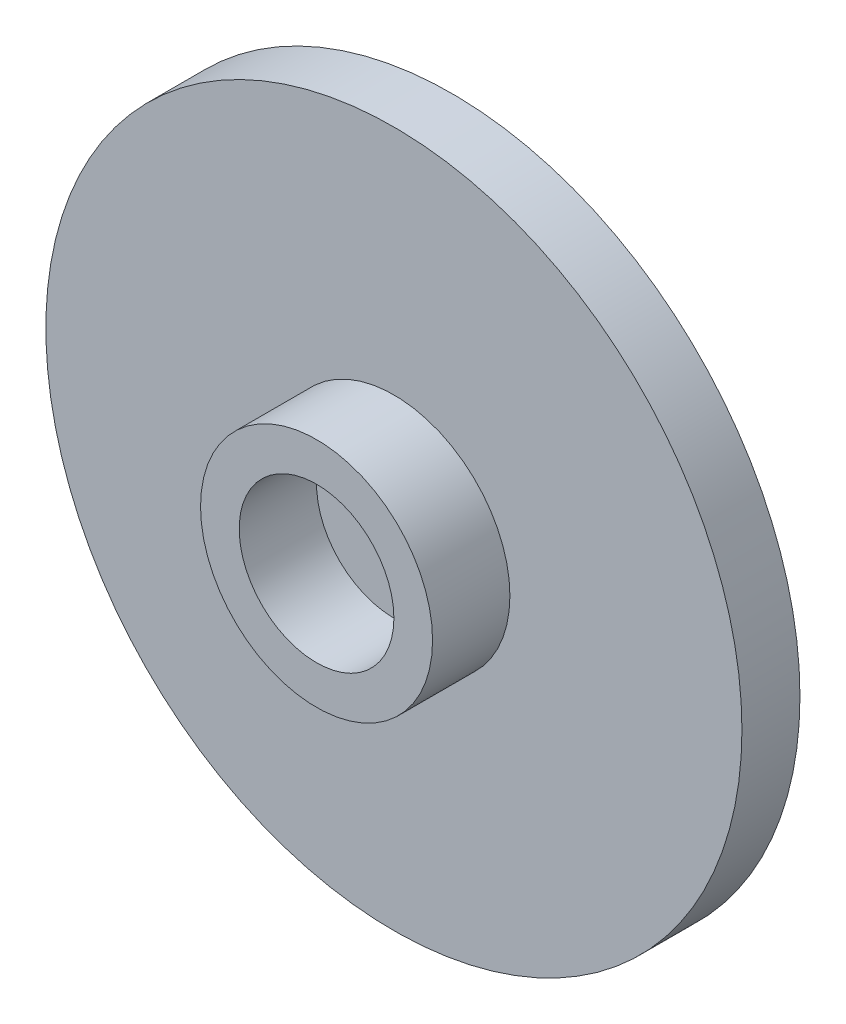
ISO-10303-21;
HEADER;
FILE_DESCRIPTION(('STEP AP214'),'2;1');
FILE_NAME('part.step','',(''),(''),'','','');
FILE_SCHEMA(('AUTOMOTIVE_DESIGN { 1 0 10303 214 1 1 1 1 }'));
ENDSEC;
DATA;
#1=APPLICATION_CONTEXT('core data for automotive mechanical design processes');
#2=APPLICATION_PROTOCOL_DEFINITION('international standard','automotive_design',2000,#1);
#3=PRODUCT_CONTEXT('',#1,'mechanical');
#4=PRODUCT('Part','Part','',(#3));
#5=PRODUCT_RELATED_PRODUCT_CATEGORY('part','',(#4));
#6=PRODUCT_DEFINITION_FORMATION('','',#4);
#7=PRODUCT_DEFINITION_CONTEXT('part definition',#1,'design');
#8=PRODUCT_DEFINITION('design','',#6,#7);
#9=PRODUCT_DEFINITION_SHAPE('','',#8);
#10=(LENGTH_UNIT() NAMED_UNIT(*) SI_UNIT(.MILLI.,.METRE.));
#11=(NAMED_UNIT(*) PLANE_ANGLE_UNIT() SI_UNIT($,.RADIAN.));
#12=(NAMED_UNIT(*) SI_UNIT($,.STERADIAN.) SOLID_ANGLE_UNIT());
#13=UNCERTAINTY_MEASURE_WITH_UNIT(LENGTH_MEASURE(1.E-05),#10,'distance_accuracy_value','');
#14=(GEOMETRIC_REPRESENTATION_CONTEXT(3) GLOBAL_UNCERTAINTY_ASSIGNED_CONTEXT((#13)) GLOBAL_UNIT_ASSIGNED_CONTEXT((#10,
#11,#12)) REPRESENTATION_CONTEXT('',''));
#15=CARTESIAN_POINT('',(0.,0.,0.));
#16=DIRECTION('',(0.,0.,1.));
#17=DIRECTION('',(1.,0.,0.));
#18=AXIS2_PLACEMENT_3D('',#15,#16,#17);
#19=CARTESIAN_POINT('',(0.,0.,0.));
#20=DIRECTION('',(0.,0.,1.));
#21=DIRECTION('',(1.,0.,0.));
#22=AXIS2_PLACEMENT_3D('',#19,#20,#21);
#23=PLANE('',#22);
#24=CARTESIAN_POINT('',(0.,0.,0.));
#25=DIRECTION('',(0.,0.,1.));
#26=DIRECTION('',(1.,0.,0.));
#27=AXIS2_PLACEMENT_3D('',#24,#25,#26);
#28=CIRCLE('',#27,0.75);
#29=CARTESIAN_POINT('',(0.75,0.,0.));
#30=VERTEX_POINT('',#29);
#31=EDGE_CURVE('E62',#30,#30,#28,.T.);
#32=ORIENTED_EDGE('',*,*,#31,.T.);
#33=EDGE_LOOP('',(#32));
#34=FACE_BOUND('',#33,.T.);
#35=CARTESIAN_POINT('',(0.,0.,0.));
#36=DIRECTION('',(0.,0.,-1.));
#37=DIRECTION('',(-1.,0.,0.));
#38=AXIS2_PLACEMENT_3D('',#35,#36,#37);
#39=CIRCLE('',#38,2.);
#40=CARTESIAN_POINT('',(-2.,0.,0.));
#41=VERTEX_POINT('',#40);
#42=EDGE_CURVE('E86',#41,#41,#39,.T.);
#43=ORIENTED_EDGE('',*,*,#42,.T.);
#44=EDGE_LOOP('',(#43));
#45=FACE_BOUND('',#44,.T.);
#46=ADVANCED_FACE('F37',(#34,#45),#23,.F.);
#47=CARTESIAN_POINT('',(0.,0.,1.5));
#48=DIRECTION('',(0.,0.,1.));
#49=DIRECTION('',(1.,0.,0.));
#50=AXIS2_PLACEMENT_3D('',#47,#48,#49);
#51=PLANE('',#50);
#52=CARTESIAN_POINT('',(0.,0.,1.5));
#53=DIRECTION('',(0.,0.,1.));
#54=DIRECTION('',(1.,0.,0.));
#55=AXIS2_PLACEMENT_3D('',#52,#53,#54);
#56=CIRCLE('',#55,0.75);
#57=CARTESIAN_POINT('',(0.75,0.,1.5));
#58=VERTEX_POINT('',#57);
#59=EDGE_CURVE('E60',#58,#58,#56,.T.);
#60=ORIENTED_EDGE('',*,*,#59,.F.);
#61=EDGE_LOOP('',(#60));
#62=FACE_BOUND('',#61,.T.);
#63=CARTESIAN_POINT('',(0.,0.,1.5));
#64=DIRECTION('',(0.,0.,1.));
#65=DIRECTION('',(1.,0.,0.));
#66=AXIS2_PLACEMENT_3D('',#63,#64,#65);
#67=CIRCLE('',#66,2.);
#68=CARTESIAN_POINT('',(2.,0.,1.5));
#69=VERTEX_POINT('',#68);
#70=EDGE_CURVE('E45',#69,#69,#67,.F.);
#71=ORIENTED_EDGE('',*,*,#70,.F.);
#72=EDGE_LOOP('',(#71));
#73=FACE_BOUND('',#72,.T.);
#74=ADVANCED_FACE('F114',(#62,#73),#51,.T.);
#75=CARTESIAN_POINT('',(0.,0.,1.5));
#76=DIRECTION('',(0.,0.,1.));
#77=DIRECTION('',(1.,0.,0.));
#78=AXIS2_PLACEMENT_3D('',#75,#76,#77);
#79=CIRCLE('',#78,3.);
#80=CARTESIAN_POINT('',(3.,0.,1.5));
#81=VERTEX_POINT('',#80);
#82=EDGE_CURVE('E70',#81,#81,#79,.T.);
#83=ORIENTED_EDGE('',*,*,#82,.F.);
#84=EDGE_LOOP('',(#83));
#85=FACE_BOUND('',#84,.T.);
#86=CARTESIAN_POINT('',(0.,0.,1.5));
#87=DIRECTION('',(0.,0.,1.));
#88=DIRECTION('',(1.,0.,0.));
#89=AXIS2_PLACEMENT_3D('',#86,#87,#88);
#90=CIRCLE('',#89,9.);
#91=CARTESIAN_POINT('',(9.,0.,1.5));
#92=VERTEX_POINT('',#91);
#93=EDGE_CURVE('E50',#92,#92,#90,.T.);
#94=ORIENTED_EDGE('',*,*,#93,.T.);
#95=EDGE_LOOP('',(#94));
#96=FACE_BOUND('',#95,.T.);
#97=ADVANCED_FACE('F120',(#85,#96),#51,.T.);
#98=CARTESIAN_POINT('',(0.,0.,0.));
#99=DIRECTION('',(0.,0.,1.));
#100=DIRECTION('',(1.,0.,0.));
#101=AXIS2_PLACEMENT_3D('',#98,#99,#100);
#102=CIRCLE('',#101,3.);
#103=CARTESIAN_POINT('',(3.,0.,0.));
#104=VERTEX_POINT('',#103);
#105=EDGE_CURVE('E10',#104,#104,#102,.F.);
#106=ORIENTED_EDGE('',*,*,#105,.F.);
#107=EDGE_LOOP('',(#106));
#108=FACE_BOUND('',#107,.T.);
#109=CARTESIAN_POINT('',(0.,0.,0.));
#110=DIRECTION('',(0.,0.,1.));
#111=DIRECTION('',(1.,0.,0.));
#112=AXIS2_PLACEMENT_3D('',#109,#110,#111);
#113=CIRCLE('',#112,9.);
#114=CARTESIAN_POINT('',(9.,0.,0.));
#115=VERTEX_POINT('',#114);
#116=EDGE_CURVE('E55',#115,#115,#113,.T.);
#117=ORIENTED_EDGE('',*,*,#116,.F.);
#118=EDGE_LOOP('',(#117));
#119=FACE_BOUND('',#118,.T.);
#120=ADVANCED_FACE('F116',(#108,#119),#23,.F.);
#121=CARTESIAN_POINT('',(0.,0.,1.5));
#122=DIRECTION('',(0.,0.,-1.));
#123=DIRECTION('',(-1.,0.,0.));
#124=AXIS2_PLACEMENT_3D('',#121,#122,#123);
#125=CYLINDRICAL_SURFACE('',#124,9.);
#126=ORIENTED_EDGE('',*,*,#93,.F.);
#127=EDGE_LOOP('',(#126));
#128=FACE_BOUND('',#127,.T.);
#129=ORIENTED_EDGE('',*,*,#116,.T.);
#130=EDGE_LOOP('',(#129));
#131=FACE_BOUND('',#130,.T.);
#132=ADVANCED_FACE('F39',(#128,#131),#125,.T.);
#133=CARTESIAN_POINT('',(0.,0.,1.5));
#134=DIRECTION('',(0.,0.,-1.));
#135=DIRECTION('',(-1.,0.,0.));
#136=AXIS2_PLACEMENT_3D('',#133,#134,#135);
#137=CYLINDRICAL_SURFACE('',#136,0.75);
#138=ORIENTED_EDGE('',*,*,#59,.T.);
#139=EDGE_LOOP('',(#138));
#140=FACE_BOUND('',#139,.T.);
#141=ORIENTED_EDGE('',*,*,#31,.F.);
#142=EDGE_LOOP('',(#141));
#143=FACE_BOUND('',#142,.T.);
#144=ADVANCED_FACE('F130',(#140,#143),#137,.F.);
#145=CARTESIAN_POINT('',(0.,0.,3.5));
#146=DIRECTION('',(0.,0.,1.));
#147=DIRECTION('',(1.,0.,0.));
#148=AXIS2_PLACEMENT_3D('',#145,#146,#147);
#149=PLANE('',#148);
#150=CARTESIAN_POINT('',(0.,0.,3.5));
#151=DIRECTION('',(0.,0.,1.));
#152=DIRECTION('',(1.,0.,0.));
#153=AXIS2_PLACEMENT_3D('',#150,#151,#152);
#154=CIRCLE('',#153,3.);
#155=CARTESIAN_POINT('',(3.,0.,3.5));
#156=VERTEX_POINT('',#155);
#157=EDGE_CURVE('E66',#156,#156,#154,.T.);
#158=ORIENTED_EDGE('',*,*,#157,.T.);
#159=EDGE_LOOP('',(#158));
#160=FACE_BOUND('',#159,.T.);
#161=CARTESIAN_POINT('',(0.,0.,3.5));
#162=DIRECTION('',(0.,0.,1.));
#163=DIRECTION('',(1.,0.,0.));
#164=AXIS2_PLACEMENT_3D('',#161,#162,#163);
#165=CIRCLE('',#164,2.);
#166=CARTESIAN_POINT('',(2.,0.,3.5));
#167=VERTEX_POINT('',#166);
#168=EDGE_CURVE('E74',#167,#167,#165,.T.);
#169=ORIENTED_EDGE('',*,*,#168,.F.);
#170=EDGE_LOOP('',(#169));
#171=FACE_BOUND('',#170,.T.);
#172=ADVANCED_FACE('F143',(#160,#171),#149,.T.);
#173=CARTESIAN_POINT('',(0.,0.,3.5));
#174=DIRECTION('',(0.,0.,-1.));
#175=DIRECTION('',(-1.,0.,0.));
#176=AXIS2_PLACEMENT_3D('',#173,#174,#175);
#177=CYLINDRICAL_SURFACE('',#176,3.);
#178=ORIENTED_EDGE('',*,*,#157,.F.);
#179=EDGE_LOOP('',(#178));
#180=FACE_BOUND('',#179,.T.);
#181=ORIENTED_EDGE('',*,*,#82,.T.);
#182=EDGE_LOOP('',(#181));
#183=FACE_BOUND('',#182,.T.);
#184=ADVANCED_FACE('F109',(#180,#183),#177,.T.);
#185=CARTESIAN_POINT('',(0.,0.,3.5));
#186=DIRECTION('',(0.,0.,-1.));
#187=DIRECTION('',(-1.,0.,0.));
#188=AXIS2_PLACEMENT_3D('',#185,#186,#187);
#189=CYLINDRICAL_SURFACE('',#188,2.);
#190=ORIENTED_EDGE('',*,*,#168,.T.);
#191=EDGE_LOOP('',(#190));
#192=FACE_BOUND('',#191,.T.);
#193=ORIENTED_EDGE('',*,*,#70,.T.);
#194=EDGE_LOOP('',(#193));
#195=FACE_BOUND('',#194,.T.);
#196=ADVANCED_FACE('F100',(#192,#195),#189,.F.);
#197=CARTESIAN_POINT('',(0.,0.,-1.));
#198=DIRECTION('',(0.,0.,-1.));
#199=DIRECTION('',(-1.,0.,0.));
#200=AXIS2_PLACEMENT_3D('',#197,#198,#199);
#201=PLANE('',#200);
#202=CARTESIAN_POINT('',(0.,0.,-1.));
#203=DIRECTION('',(0.,0.,-1.));
#204=DIRECTION('',(-1.,0.,0.));
#205=AXIS2_PLACEMENT_3D('',#202,#203,#204);
#206=CIRCLE('',#205,3.);
#207=CARTESIAN_POINT('',(-3.,0.,-1.));
#208=VERTEX_POINT('',#207);
#209=EDGE_CURVE('E81',#208,#208,#206,.T.);
#210=ORIENTED_EDGE('',*,*,#209,.T.);
#211=EDGE_LOOP('',(#210));
#212=FACE_BOUND('',#211,.T.);
#213=CARTESIAN_POINT('',(0.,0.,-1.));
#214=DIRECTION('',(0.,0.,-1.));
#215=DIRECTION('',(-1.,0.,0.));
#216=AXIS2_PLACEMENT_3D('',#213,#214,#215);
#217=CIRCLE('',#216,2.);
#218=CARTESIAN_POINT('',(-2.,0.,-1.));
#219=VERTEX_POINT('',#218);
#220=EDGE_CURVE('E85',#219,#219,#217,.T.);
#221=ORIENTED_EDGE('',*,*,#220,.F.);
#222=EDGE_LOOP('',(#221));
#223=FACE_BOUND('',#222,.T.);
#224=ADVANCED_FACE('F97',(#212,#223),#201,.T.);
#225=CARTESIAN_POINT('',(0.,0.,-1.));
#226=DIRECTION('',(0.,0.,1.));
#227=DIRECTION('',(1.,0.,0.));
#228=AXIS2_PLACEMENT_3D('',#225,#226,#227);
#229=CYLINDRICAL_SURFACE('',#228,3.);
#230=ORIENTED_EDGE('',*,*,#209,.F.);
#231=EDGE_LOOP('',(#230));
#232=FACE_BOUND('',#231,.T.);
#233=ORIENTED_EDGE('',*,*,#105,.T.);
#234=EDGE_LOOP('',(#233));
#235=FACE_BOUND('',#234,.T.);
#236=ADVANCED_FACE('F99',(#232,#235),#229,.T.);
#237=CARTESIAN_POINT('',(0.,0.,-1.));
#238=DIRECTION('',(0.,0.,1.));
#239=DIRECTION('',(1.,0.,0.));
#240=AXIS2_PLACEMENT_3D('',#237,#238,#239);
#241=CYLINDRICAL_SURFACE('',#240,2.);
#242=ORIENTED_EDGE('',*,*,#220,.T.);
#243=EDGE_LOOP('',(#242));
#244=FACE_BOUND('',#243,.T.);
#245=ORIENTED_EDGE('',*,*,#42,.F.);
#246=EDGE_LOOP('',(#245));
#247=FACE_BOUND('',#246,.T.);
#248=ADVANCED_FACE('F94',(#244,#247),#241,.F.);
#249=CLOSED_SHELL('',(#46,#74,#97,#120,#132,#144,#172,#184,#196,#224,#236,#248));
#250=MANIFOLD_SOLID_BREP('B2',#249);
#251=ADVANCED_BREP_SHAPE_REPRESENTATION('',(#18,#250),#14);
#252=SHAPE_DEFINITION_REPRESENTATION(#9,#251);
ENDSEC;
END-ISO-10303-21;
